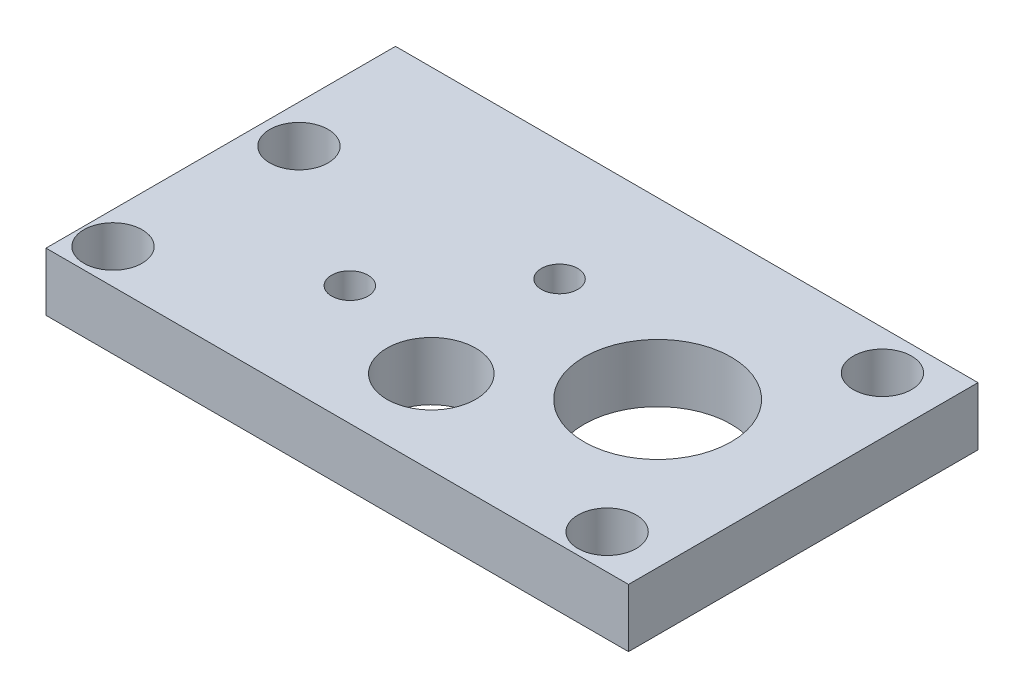
ISO-10303-21;
HEADER;
FILE_DESCRIPTION(('STEP AP214'),'2;1');
FILE_NAME('part.step','',(''),(''),'','','');
FILE_SCHEMA(('AUTOMOTIVE_DESIGN { 1 0 10303 214 1 1 1 1 }'));
ENDSEC;
DATA;
#1=APPLICATION_CONTEXT('core data for automotive mechanical design processes');
#2=APPLICATION_PROTOCOL_DEFINITION('international standard','automotive_design',2000,#1);
#3=PRODUCT_CONTEXT('',#1,'mechanical');
#4=PRODUCT('Part','Part','',(#3));
#5=PRODUCT_RELATED_PRODUCT_CATEGORY('part','',(#4));
#6=PRODUCT_DEFINITION_FORMATION('','',#4);
#7=PRODUCT_DEFINITION_CONTEXT('part definition',#1,'design');
#8=PRODUCT_DEFINITION('design','',#6,#7);
#9=PRODUCT_DEFINITION_SHAPE('','',#8);
#10=(LENGTH_UNIT() NAMED_UNIT(*) SI_UNIT(.MILLI.,.METRE.));
#11=(NAMED_UNIT(*) PLANE_ANGLE_UNIT() SI_UNIT($,.RADIAN.));
#12=(NAMED_UNIT(*) SI_UNIT($,.STERADIAN.) SOLID_ANGLE_UNIT());
#13=UNCERTAINTY_MEASURE_WITH_UNIT(LENGTH_MEASURE(1.E-05),#10,'distance_accuracy_value','');
#14=(GEOMETRIC_REPRESENTATION_CONTEXT(3) GLOBAL_UNCERTAINTY_ASSIGNED_CONTEXT((#13)) GLOBAL_UNIT_ASSIGNED_CONTEXT((#10,
#11,#12)) REPRESENTATION_CONTEXT('',''));
#15=CARTESIAN_POINT('',(0.,0.,0.));
#16=DIRECTION('',(0.,0.,1.));
#17=DIRECTION('',(1.,0.,0.));
#18=AXIS2_PLACEMENT_3D('',#15,#16,#17);
#19=CARTESIAN_POINT('',(1.31063028866199,0.,4.6262787538841));
#20=DIRECTION('',(0.,1.,0.));
#21=DIRECTION('',(0.,0.,1.));
#22=AXIS2_PLACEMENT_3D('',#19,#20,#21);
#23=CYLINDRICAL_SURFACE('',#22,0.7);
#24=CARTESIAN_POINT('',(1.31063028866199,0.,4.6262787538841));
#25=DIRECTION('',(0.,1.,0.));
#26=DIRECTION('',(0.,0.,1.));
#27=AXIS2_PLACEMENT_3D('',#24,#25,#26);
#28=CIRCLE('',#27,0.7);
#29=CARTESIAN_POINT('',(1.31063028866199,0.,5.3262787538841));
#30=VERTEX_POINT('',#29);
#31=EDGE_CURVE('E202',#30,#30,#28,.T.);
#32=ORIENTED_EDGE('',*,*,#31,.F.);
#33=EDGE_LOOP('',(#32));
#34=FACE_BOUND('',#33,.T.);
#35=CARTESIAN_POINT('',(1.31063028866199,0.5,4.6262787538841));
#36=DIRECTION('',(0.,1.,0.));
#37=DIRECTION('',(0.,0.,1.));
#38=AXIS2_PLACEMENT_3D('',#35,#36,#37);
#39=CIRCLE('',#38,0.7);
#40=CARTESIAN_POINT('',(1.31063028866199,0.5,5.3262787538841));
#41=VERTEX_POINT('',#40);
#42=EDGE_CURVE('E99',#41,#41,#39,.F.);
#43=ORIENTED_EDGE('',*,*,#42,.F.);
#44=EDGE_LOOP('',(#43));
#45=FACE_BOUND('',#44,.T.);
#46=ADVANCED_FACE('F95',(#34,#45),#23,.F.);
#47=CARTESIAN_POINT('',(18.0671599235635,0.,10.8014828316621));
#48=DIRECTION('',(0.,1.,0.));
#49=DIRECTION('',(0.,0.,1.));
#50=AXIS2_PLACEMENT_3D('',#47,#48,#49);
#51=CYLINDRICAL_SURFACE('',#50,0.699999999999998);
#52=CARTESIAN_POINT('',(18.0671599235635,0.,10.8014828316621));
#53=DIRECTION('',(0.,1.,0.));
#54=DIRECTION('',(0.,0.,1.));
#55=AXIS2_PLACEMENT_3D('',#52,#53,#54);
#56=CIRCLE('',#55,0.699999999999998);
#57=CARTESIAN_POINT('',(18.0671599235635,0.,11.5014828316621));
#58=VERTEX_POINT('',#57);
#59=EDGE_CURVE('E186',#58,#58,#56,.T.);
#60=ORIENTED_EDGE('',*,*,#59,.F.);
#61=EDGE_LOOP('',(#60));
#62=FACE_BOUND('',#61,.T.);
#63=CARTESIAN_POINT('',(18.0671599235635,0.5,10.8014828316621));
#64=DIRECTION('',(0.,1.,0.));
#65=DIRECTION('',(0.,0.,1.));
#66=AXIS2_PLACEMENT_3D('',#63,#64,#65);
#67=CIRCLE('',#66,0.699999999999998);
#68=CARTESIAN_POINT('',(18.0671599235635,0.5,11.5014828316621));
#69=VERTEX_POINT('',#68);
#70=EDGE_CURVE('E181',#69,#69,#67,.F.);
#71=ORIENTED_EDGE('',*,*,#70,.F.);
#72=EDGE_LOOP('',(#71));
#73=FACE_BOUND('',#72,.T.);
#74=ADVANCED_FACE('F246',(#62,#73),#51,.F.);
#75=CARTESIAN_POINT('',(18.0671599235635,0.,1.34892989004029));
#76=DIRECTION('',(0.,1.,0.));
#77=DIRECTION('',(0.,0.,1.));
#78=AXIS2_PLACEMENT_3D('',#75,#76,#77);
#79=CYLINDRICAL_SURFACE('',#78,0.699999999999998);
#80=CARTESIAN_POINT('',(18.0671599235635,0.,1.34892989004029));
#81=DIRECTION('',(0.,1.,0.));
#82=DIRECTION('',(0.,0.,1.));
#83=AXIS2_PLACEMENT_3D('',#80,#81,#82);
#84=CIRCLE('',#83,0.699999999999998);
#85=CARTESIAN_POINT('',(18.0671599235635,0.,2.04892989004029));
#86=VERTEX_POINT('',#85);
#87=EDGE_CURVE('E190',#86,#86,#84,.T.);
#88=ORIENTED_EDGE('',*,*,#87,.F.);
#89=EDGE_LOOP('',(#88));
#90=FACE_BOUND('',#89,.T.);
#91=CARTESIAN_POINT('',(18.0671599235635,0.5,1.34892989004029));
#92=DIRECTION('',(0.,1.,0.));
#93=DIRECTION('',(0.,0.,1.));
#94=AXIS2_PLACEMENT_3D('',#91,#92,#93);
#95=CIRCLE('',#94,0.699999999999998);
#96=CARTESIAN_POINT('',(18.0671599235635,0.5,2.04892989004029));
#97=VERTEX_POINT('',#96);
#98=EDGE_CURVE('E178',#97,#97,#95,.F.);
#99=ORIENTED_EDGE('',*,*,#98,.F.);
#100=EDGE_LOOP('',(#99));
#101=FACE_BOUND('',#100,.T.);
#102=ADVANCED_FACE('F252',(#90,#101),#79,.F.);
#103=CARTESIAN_POINT('',(1.1013013368729,0.,10.8014828316621));
#104=DIRECTION('',(0.,1.,0.));
#105=DIRECTION('',(0.,0.,1.));
#106=AXIS2_PLACEMENT_3D('',#103,#104,#105);
#107=CYLINDRICAL_SURFACE('',#106,0.700000000000001);
#108=CARTESIAN_POINT('',(1.1013013368729,0.,10.8014828316621));
#109=DIRECTION('',(0.,1.,0.));
#110=DIRECTION('',(0.,0.,1.));
#111=AXIS2_PLACEMENT_3D('',#108,#109,#110);
#112=CIRCLE('',#111,0.700000000000001);
#113=CARTESIAN_POINT('',(1.1013013368729,0.,11.5014828316621));
#114=VERTEX_POINT('',#113);
#115=EDGE_CURVE('E195',#114,#114,#112,.T.);
#116=ORIENTED_EDGE('',*,*,#115,.F.);
#117=EDGE_LOOP('',(#116));
#118=FACE_BOUND('',#117,.T.);
#119=CARTESIAN_POINT('',(1.1013013368729,0.5,10.8014828316621));
#120=DIRECTION('',(0.,1.,0.));
#121=DIRECTION('',(0.,0.,1.));
#122=AXIS2_PLACEMENT_3D('',#119,#120,#121);
#123=CIRCLE('',#122,0.700000000000001);
#124=CARTESIAN_POINT('',(1.1013013368729,0.5,11.5014828316621));
#125=VERTEX_POINT('',#124);
#126=EDGE_CURVE('E175',#125,#125,#123,.F.);
#127=ORIENTED_EDGE('',*,*,#126,.F.);
#128=EDGE_LOOP('',(#127));
#129=FACE_BOUND('',#128,.T.);
#130=ADVANCED_FACE('F281',(#118,#129),#107,.F.);
#131=CARTESIAN_POINT('',(0.,2.,0.));
#132=DIRECTION('',(0.,-1.,0.));
#133=DIRECTION('',(0.,0.,-1.));
#134=AXIS2_PLACEMENT_3D('',#131,#132,#133);
#135=PLANE('',#134);
#136=CARTESIAN_POINT('',(18.0671599235635,2.,1.34892989004029));
#137=DIRECTION('',(0.,1.,0.));
#138=DIRECTION('',(0.,0.,1.));
#139=AXIS2_PLACEMENT_3D('',#136,#137,#138);
#140=CIRCLE('',#139,1.);
#141=CARTESIAN_POINT('',(18.0671599235635,2.,2.34892989004029));
#142=VERTEX_POINT('',#141);
#143=EDGE_CURVE('E457',#142,#142,#140,.T.);
#144=ORIENTED_EDGE('',*,*,#143,.F.);
#145=EDGE_LOOP('',(#144));
#146=FACE_BOUND('',#145,.T.);
#147=CARTESIAN_POINT('',(18.0671599235635,2.,10.8014828316621));
#148=DIRECTION('',(0.,1.,0.));
#149=DIRECTION('',(0.,0.,1.));
#150=AXIS2_PLACEMENT_3D('',#147,#148,#149);
#151=CIRCLE('',#150,1.);
#152=CARTESIAN_POINT('',(18.0671599235635,2.,11.8014828316621));
#153=VERTEX_POINT('',#152);
#154=EDGE_CURVE('E449',#153,#153,#151,.T.);
#155=ORIENTED_EDGE('',*,*,#154,.F.);
#156=EDGE_LOOP('',(#155));
#157=FACE_BOUND('',#156,.T.);
#158=CARTESIAN_POINT('',(1.1013013368729,2.,10.8014828316621));
#159=DIRECTION('',(0.,1.,0.));
#160=DIRECTION('',(0.,0.,1.));
#161=AXIS2_PLACEMENT_3D('',#158,#159,#160);
#162=CIRCLE('',#161,1.);
#163=CARTESIAN_POINT('',(1.1013013368729,2.,11.8014828316621));
#164=VERTEX_POINT('',#163);
#165=EDGE_CURVE('E442',#164,#164,#162,.T.);
#166=ORIENTED_EDGE('',*,*,#165,.F.);
#167=EDGE_LOOP('',(#166));
#168=FACE_BOUND('',#167,.T.);
#169=CARTESIAN_POINT('',(1.31063028866199,2.,4.6262787538841));
#170=DIRECTION('',(0.,1.,0.));
#171=DIRECTION('',(0.,0.,1.));
#172=AXIS2_PLACEMENT_3D('',#169,#170,#171);
#173=CIRCLE('',#172,1.);
#174=CARTESIAN_POINT('',(1.31063028866199,2.,5.6262787538841));
#175=VERTEX_POINT('',#174);
#176=EDGE_CURVE('E199',#175,#175,#173,.T.);
#177=ORIENTED_EDGE('',*,*,#176,.F.);
#178=EDGE_LOOP('',(#177));
#179=FACE_BOUND('',#178,.T.);
#180=DIRECTION('',(1.,0.,0.));
#181=VECTOR('',#180,1.);
#182=CARTESIAN_POINT('',(0.,2.,0.));
#183=LINE('',#182,#181);
#184=CARTESIAN_POINT('',(0.,2.,0.));
#185=VERTEX_POINT('',#184);
#186=CARTESIAN_POINT('',(20.,2.,0.));
#187=VERTEX_POINT('',#186);
#188=EDGE_CURVE('E159',#185,#187,#183,.T.);
#189=ORIENTED_EDGE('',*,*,#188,.F.);
#190=DIRECTION('',(0.,0.,1.));
#191=VECTOR('',#190,1.);
#192=CARTESIAN_POINT('',(0.,2.,0.));
#193=LINE('',#192,#191);
#194=CARTESIAN_POINT('',(0.,2.,12.));
#195=VERTEX_POINT('',#194);
#196=EDGE_CURVE('E148',#185,#195,#193,.T.);
#197=ORIENTED_EDGE('',*,*,#196,.T.);
#198=DIRECTION('',(1.,0.,0.));
#199=VECTOR('',#198,1.);
#200=CARTESIAN_POINT('',(0.,2.,12.));
#201=LINE('',#200,#199);
#202=CARTESIAN_POINT('',(20.,2.,12.));
#203=VERTEX_POINT('',#202);
#204=EDGE_CURVE('E142',#195,#203,#201,.T.);
#205=ORIENTED_EDGE('',*,*,#204,.T.);
#206=DIRECTION('',(0.,0.,1.));
#207=VECTOR('',#206,1.);
#208=CARTESIAN_POINT('',(20.,2.,0.));
#209=LINE('',#208,#207);
#210=EDGE_CURVE('E147',#187,#203,#209,.T.);
#211=ORIENTED_EDGE('',*,*,#210,.F.);
#212=EDGE_LOOP('',(#189,#197,#205,#211));
#213=FACE_BOUND('',#212,.T.);
#214=CARTESIAN_POINT('',(9.73286382647969,2.,4.1));
#215=DIRECTION('',(0.,1.,0.));
#216=DIRECTION('',(0.,0.,1.));
#217=AXIS2_PLACEMENT_3D('',#214,#215,#216);
#218=CIRCLE('',#217,0.625000000000001);
#219=CARTESIAN_POINT('',(9.73286382647969,2.,4.725));
#220=VERTEX_POINT('',#219);
#221=EDGE_CURVE('E169',#220,#220,#218,.T.);
#222=ORIENTED_EDGE('',*,*,#221,.F.);
#223=EDGE_LOOP('',(#222));
#224=FACE_BOUND('',#223,.T.);
#225=CARTESIAN_POINT('',(10.3501019215946,2.,9.12064862816079));
#226=DIRECTION('',(0.,1.,0.));
#227=DIRECTION('',(0.,0.,1.));
#228=AXIS2_PLACEMENT_3D('',#225,#226,#227);
#229=CIRCLE('',#228,1.525);
#230=CARTESIAN_POINT('',(10.3501019215946,2.,10.6456486281608));
#231=VERTEX_POINT('',#230);
#232=EDGE_CURVE('E219',#231,#231,#229,.T.);
#233=ORIENTED_EDGE('',*,*,#232,.F.);
#234=EDGE_LOOP('',(#233));
#235=FACE_BOUND('',#234,.T.);
#236=CARTESIAN_POINT('',(6.33139355614071,2.,7.9));
#237=DIRECTION('',(0.,1.,0.));
#238=DIRECTION('',(0.,0.,1.));
#239=AXIS2_PLACEMENT_3D('',#236,#237,#238);
#240=CIRCLE('',#239,0.625);
#241=CARTESIAN_POINT('',(6.33139355614071,2.,8.525));
#242=VERTEX_POINT('',#241);
#243=EDGE_CURVE('E213',#242,#242,#240,.T.);
#244=ORIENTED_EDGE('',*,*,#243,.F.);
#245=EDGE_LOOP('',(#244));
#246=FACE_BOUND('',#245,.T.);
#247=CARTESIAN_POINT('',(15.,2.,6.));
#248=DIRECTION('',(0.,1.,0.));
#249=DIRECTION('',(0.,0.,1.));
#250=AXIS2_PLACEMENT_3D('',#247,#248,#249);
#251=CIRCLE('',#250,2.525);
#252=CARTESIAN_POINT('',(15.,2.,8.525));
#253=VERTEX_POINT('',#252);
#254=EDGE_CURVE('E207',#253,#253,#251,.T.);
#255=ORIENTED_EDGE('',*,*,#254,.F.);
#256=EDGE_LOOP('',(#255));
#257=FACE_BOUND('',#256,.T.);
#258=ADVANCED_FACE('F145',(#146,#157,#168,#179,#213,#224,#235,#246,#257),#135,.F.);
#259=CARTESIAN_POINT('',(0.,0.,0.));
#260=DIRECTION('',(0.,-1.,0.));
#261=DIRECTION('',(0.,0.,-1.));
#262=AXIS2_PLACEMENT_3D('',#259,#260,#261);
#263=PLANE('',#262);
#264=ORIENTED_EDGE('',*,*,#115,.T.);
#265=EDGE_LOOP('',(#264));
#266=FACE_BOUND('',#265,.T.);
#267=ORIENTED_EDGE('',*,*,#87,.T.);
#268=EDGE_LOOP('',(#267));
#269=FACE_BOUND('',#268,.T.);
#270=ORIENTED_EDGE('',*,*,#59,.T.);
#271=EDGE_LOOP('',(#270));
#272=FACE_BOUND('',#271,.T.);
#273=ORIENTED_EDGE('',*,*,#31,.T.);
#274=EDGE_LOOP('',(#273));
#275=FACE_BOUND('',#274,.T.);
#276=CARTESIAN_POINT('',(6.33139355614071,0.,7.9));
#277=DIRECTION('',(0.,1.,0.));
#278=DIRECTION('',(0.,0.,1.));
#279=AXIS2_PLACEMENT_3D('',#276,#277,#278);
#280=CIRCLE('',#279,0.625);
#281=CARTESIAN_POINT('',(6.33139355614071,0.,8.525));
#282=VERTEX_POINT('',#281);
#283=EDGE_CURVE('E210',#282,#282,#280,.T.);
#284=ORIENTED_EDGE('',*,*,#283,.T.);
#285=EDGE_LOOP('',(#284));
#286=FACE_BOUND('',#285,.T.);
#287=CARTESIAN_POINT('',(9.73286382647969,0.,4.1));
#288=DIRECTION('',(0.,1.,0.));
#289=DIRECTION('',(0.,0.,1.));
#290=AXIS2_PLACEMENT_3D('',#287,#288,#289);
#291=CIRCLE('',#290,0.625000000000001);
#292=CARTESIAN_POINT('',(9.73286382647969,0.,4.725));
#293=VERTEX_POINT('',#292);
#294=EDGE_CURVE('E222',#293,#293,#291,.T.);
#295=ORIENTED_EDGE('',*,*,#294,.T.);
#296=EDGE_LOOP('',(#295));
#297=FACE_BOUND('',#296,.T.);
#298=DIRECTION('',(1.,0.,0.));
#299=VECTOR('',#298,1.);
#300=CARTESIAN_POINT('',(0.,0.,0.));
#301=LINE('',#300,#299);
#302=CARTESIAN_POINT('',(0.,0.,0.));
#303=VERTEX_POINT('',#302);
#304=CARTESIAN_POINT('',(20.,0.,0.));
#305=VERTEX_POINT('',#304);
#306=EDGE_CURVE('E165',#303,#305,#301,.T.);
#307=ORIENTED_EDGE('',*,*,#306,.T.);
#308=DIRECTION('',(0.,0.,1.));
#309=VECTOR('',#308,1.);
#310=CARTESIAN_POINT('',(20.,0.,0.));
#311=LINE('',#310,#309);
#312=CARTESIAN_POINT('',(20.,0.,12.));
#313=VERTEX_POINT('',#312);
#314=EDGE_CURVE('E168',#305,#313,#311,.T.);
#315=ORIENTED_EDGE('',*,*,#314,.T.);
#316=DIRECTION('',(1.,0.,0.));
#317=VECTOR('',#316,1.);
#318=CARTESIAN_POINT('',(0.,0.,12.));
#319=LINE('',#318,#317);
#320=CARTESIAN_POINT('',(0.,0.,12.));
#321=VERTEX_POINT('',#320);
#322=EDGE_CURVE('E155',#321,#313,#319,.T.);
#323=ORIENTED_EDGE('',*,*,#322,.F.);
#324=DIRECTION('',(0.,0.,1.));
#325=VECTOR('',#324,1.);
#326=CARTESIAN_POINT('',(0.,0.,0.));
#327=LINE('',#326,#325);
#328=EDGE_CURVE('E129',#303,#321,#327,.T.);
#329=ORIENTED_EDGE('',*,*,#328,.F.);
#330=EDGE_LOOP('',(#307,#315,#323,#329));
#331=FACE_BOUND('',#330,.T.);
#332=CARTESIAN_POINT('',(10.3501019215946,0.,9.12064862816079));
#333=DIRECTION('',(0.,1.,0.));
#334=DIRECTION('',(0.,0.,1.));
#335=AXIS2_PLACEMENT_3D('',#332,#333,#334);
#336=CIRCLE('',#335,1.525);
#337=CARTESIAN_POINT('',(10.3501019215946,0.,10.6456486281608));
#338=VERTEX_POINT('',#337);
#339=EDGE_CURVE('E216',#338,#338,#336,.T.);
#340=ORIENTED_EDGE('',*,*,#339,.T.);
#341=EDGE_LOOP('',(#340));
#342=FACE_BOUND('',#341,.T.);
#343=CARTESIAN_POINT('',(15.,0.,6.));
#344=DIRECTION('',(0.,1.,0.));
#345=DIRECTION('',(0.,0.,1.));
#346=AXIS2_PLACEMENT_3D('',#343,#344,#345);
#347=CIRCLE('',#346,2.525);
#348=CARTESIAN_POINT('',(15.,0.,8.525));
#349=VERTEX_POINT('',#348);
#350=EDGE_CURVE('E206',#349,#349,#347,.T.);
#351=ORIENTED_EDGE('',*,*,#350,.T.);
#352=EDGE_LOOP('',(#351));
#353=FACE_BOUND('',#352,.T.);
#354=ADVANCED_FACE('F229',(#266,#269,#272,#275,#286,#297,#331,#342,#353),#263,.T.);
#355=CARTESIAN_POINT('',(0.,2.,0.));
#356=DIRECTION('',(0.,0.,-1.));
#357=DIRECTION('',(-1.,0.,0.));
#358=AXIS2_PLACEMENT_3D('',#355,#356,#357);
#359=PLANE('',#358);
#360=ORIENTED_EDGE('',*,*,#306,.F.);
#361=DIRECTION('',(0.,-1.,0.));
#362=VECTOR('',#361,1.);
#363=CARTESIAN_POINT('',(0.,2.,0.));
#364=LINE('',#363,#362);
#365=EDGE_CURVE('E12',#185,#303,#364,.T.);
#366=ORIENTED_EDGE('',*,*,#365,.F.);
#367=ORIENTED_EDGE('',*,*,#188,.T.);
#368=DIRECTION('',(0.,-1.,0.));
#369=VECTOR('',#368,1.);
#370=CARTESIAN_POINT('',(20.,2.,0.));
#371=LINE('',#370,#369);
#372=EDGE_CURVE('E137',#187,#305,#371,.T.);
#373=ORIENTED_EDGE('',*,*,#372,.T.);
#374=EDGE_LOOP('',(#360,#366,#367,#373));
#375=FACE_BOUND('',#374,.T.);
#376=ADVANCED_FACE('F97',(#375),#359,.T.);
#377=CARTESIAN_POINT('',(0.,2.,0.));
#378=DIRECTION('',(1.,0.,0.));
#379=DIRECTION('',(0.,0.,-1.));
#380=AXIS2_PLACEMENT_3D('',#377,#378,#379);
#381=PLANE('',#380);
#382=ORIENTED_EDGE('',*,*,#328,.T.);
#383=DIRECTION('',(0.,-1.,0.));
#384=VECTOR('',#383,1.);
#385=CARTESIAN_POINT('',(0.,2.,12.));
#386=LINE('',#385,#384);
#387=EDGE_CURVE('E105',#195,#321,#386,.T.);
#388=ORIENTED_EDGE('',*,*,#387,.F.);
#389=ORIENTED_EDGE('',*,*,#196,.F.);
#390=ORIENTED_EDGE('',*,*,#365,.T.);
#391=EDGE_LOOP('',(#382,#388,#389,#390));
#392=FACE_BOUND('',#391,.T.);
#393=ADVANCED_FACE('F280',(#392),#381,.F.);
#394=CARTESIAN_POINT('',(0.,2.,12.));
#395=DIRECTION('',(0.,0.,-1.));
#396=DIRECTION('',(-1.,0.,0.));
#397=AXIS2_PLACEMENT_3D('',#394,#395,#396);
#398=PLANE('',#397);
#399=ORIENTED_EDGE('',*,*,#322,.T.);
#400=DIRECTION('',(0.,-1.,0.));
#401=VECTOR('',#400,1.);
#402=CARTESIAN_POINT('',(20.,2.,12.));
#403=LINE('',#402,#401);
#404=EDGE_CURVE('E152',#203,#313,#403,.T.);
#405=ORIENTED_EDGE('',*,*,#404,.F.);
#406=ORIENTED_EDGE('',*,*,#204,.F.);
#407=ORIENTED_EDGE('',*,*,#387,.T.);
#408=EDGE_LOOP('',(#399,#405,#406,#407));
#409=FACE_BOUND('',#408,.T.);
#410=ADVANCED_FACE('F153',(#409),#398,.F.);
#411=CARTESIAN_POINT('',(20.,2.,0.));
#412=DIRECTION('',(1.,0.,0.));
#413=DIRECTION('',(0.,0.,-1.));
#414=AXIS2_PLACEMENT_3D('',#411,#412,#413);
#415=PLANE('',#414);
#416=ORIENTED_EDGE('',*,*,#314,.F.);
#417=ORIENTED_EDGE('',*,*,#372,.F.);
#418=ORIENTED_EDGE('',*,*,#210,.T.);
#419=ORIENTED_EDGE('',*,*,#404,.T.);
#420=EDGE_LOOP('',(#416,#417,#418,#419));
#421=FACE_BOUND('',#420,.T.);
#422=ADVANCED_FACE('F158',(#421),#415,.T.);
#423=CARTESIAN_POINT('',(9.73286382647969,2.,4.1));
#424=DIRECTION('',(0.,-1.,0.));
#425=DIRECTION('',(0.,0.,-1.));
#426=AXIS2_PLACEMENT_3D('',#423,#424,#425);
#427=CYLINDRICAL_SURFACE('',#426,0.625000000000001);
#428=ORIENTED_EDGE('',*,*,#221,.T.);
#429=EDGE_LOOP('',(#428));
#430=FACE_BOUND('',#429,.T.);
#431=ORIENTED_EDGE('',*,*,#294,.F.);
#432=EDGE_LOOP('',(#431));
#433=FACE_BOUND('',#432,.T.);
#434=ADVANCED_FACE('F232',(#430,#433),#427,.F.);
#435=CARTESIAN_POINT('',(10.3501019215946,2.,9.12064862816079));
#436=DIRECTION('',(0.,-1.,0.));
#437=DIRECTION('',(0.,0.,-1.));
#438=AXIS2_PLACEMENT_3D('',#435,#436,#437);
#439=CYLINDRICAL_SURFACE('',#438,1.525);
#440=ORIENTED_EDGE('',*,*,#232,.T.);
#441=EDGE_LOOP('',(#440));
#442=FACE_BOUND('',#441,.T.);
#443=ORIENTED_EDGE('',*,*,#339,.F.);
#444=EDGE_LOOP('',(#443));
#445=FACE_BOUND('',#444,.T.);
#446=ADVANCED_FACE('F234',(#442,#445),#439,.F.);
#447=CARTESIAN_POINT('',(6.33139355614071,2.,7.9));
#448=DIRECTION('',(0.,-1.,0.));
#449=DIRECTION('',(0.,0.,-1.));
#450=AXIS2_PLACEMENT_3D('',#447,#448,#449);
#451=CYLINDRICAL_SURFACE('',#450,0.625);
#452=ORIENTED_EDGE('',*,*,#243,.T.);
#453=EDGE_LOOP('',(#452));
#454=FACE_BOUND('',#453,.T.);
#455=ORIENTED_EDGE('',*,*,#283,.F.);
#456=EDGE_LOOP('',(#455));
#457=FACE_BOUND('',#456,.T.);
#458=ADVANCED_FACE('F241',(#454,#457),#451,.F.);
#459=CARTESIAN_POINT('',(15.,2.,6.));
#460=DIRECTION('',(0.,-1.,0.));
#461=DIRECTION('',(0.,0.,-1.));
#462=AXIS2_PLACEMENT_3D('',#459,#460,#461);
#463=CYLINDRICAL_SURFACE('',#462,2.525);
#464=ORIENTED_EDGE('',*,*,#254,.T.);
#465=EDGE_LOOP('',(#464));
#466=FACE_BOUND('',#465,.T.);
#467=ORIENTED_EDGE('',*,*,#350,.F.);
#468=EDGE_LOOP('',(#467));
#469=FACE_BOUND('',#468,.T.);
#470=ADVANCED_FACE('F260',(#466,#469),#463,.F.);
#471=CARTESIAN_POINT('',(1.1013013368729,0.5,10.8014828316621));
#472=DIRECTION('',(0.,1.,0.));
#473=DIRECTION('',(0.,0.,1.));
#474=AXIS2_PLACEMENT_3D('',#471,#472,#473);
#475=PLANE('',#474);
#476=CARTESIAN_POINT('',(1.1013013368729,0.5,10.8014828316621));
#477=DIRECTION('',(0.,1.,0.));
#478=DIRECTION('',(0.,0.,1.));
#479=AXIS2_PLACEMENT_3D('',#476,#477,#478);
#480=CIRCLE('',#479,1.);
#481=CARTESIAN_POINT('',(1.1013013368729,0.5,11.8014828316621));
#482=VERTEX_POINT('',#481);
#483=EDGE_CURVE('E444',#482,#482,#480,.T.);
#484=ORIENTED_EDGE('',*,*,#483,.T.);
#485=EDGE_LOOP('',(#484));
#486=FACE_BOUND('',#485,.T.);
#487=ORIENTED_EDGE('',*,*,#126,.T.);
#488=EDGE_LOOP('',(#487));
#489=FACE_BOUND('',#488,.T.);
#490=ADVANCED_FACE('F263',(#486,#489),#475,.T.);
#491=CARTESIAN_POINT('',(1.1013013368729,0.5,10.8014828316621));
#492=DIRECTION('',(0.,1.,0.));
#493=DIRECTION('',(0.,0.,1.));
#494=AXIS2_PLACEMENT_3D('',#491,#492,#493);
#495=CYLINDRICAL_SURFACE('',#494,1.);
#496=ORIENTED_EDGE('',*,*,#483,.F.);
#497=EDGE_LOOP('',(#496));
#498=FACE_BOUND('',#497,.T.);
#499=ORIENTED_EDGE('',*,*,#165,.T.);
#500=EDGE_LOOP('',(#499));
#501=FACE_BOUND('',#500,.T.);
#502=ADVANCED_FACE('F362',(#498,#501),#495,.F.);
#503=CARTESIAN_POINT('',(18.0671599235635,0.5,1.34892989004029));
#504=DIRECTION('',(0.,1.,0.));
#505=DIRECTION('',(0.,0.,1.));
#506=AXIS2_PLACEMENT_3D('',#503,#504,#505);
#507=PLANE('',#506);
#508=CARTESIAN_POINT('',(18.0671599235635,0.5,1.34892989004029));
#509=DIRECTION('',(0.,1.,0.));
#510=DIRECTION('',(0.,0.,1.));
#511=AXIS2_PLACEMENT_3D('',#508,#509,#510);
#512=CIRCLE('',#511,1.);
#513=CARTESIAN_POINT('',(18.0671599235635,0.5,2.34892989004029));
#514=VERTEX_POINT('',#513);
#515=EDGE_CURVE('E460',#514,#514,#512,.T.);
#516=ORIENTED_EDGE('',*,*,#515,.T.);
#517=EDGE_LOOP('',(#516));
#518=FACE_BOUND('',#517,.T.);
#519=ORIENTED_EDGE('',*,*,#98,.T.);
#520=EDGE_LOOP('',(#519));
#521=FACE_BOUND('',#520,.T.);
#522=ADVANCED_FACE('F372',(#518,#521),#507,.T.);
#523=CARTESIAN_POINT('',(18.0671599235635,0.5,1.34892989004029));
#524=DIRECTION('',(0.,1.,0.));
#525=DIRECTION('',(0.,0.,1.));
#526=AXIS2_PLACEMENT_3D('',#523,#524,#525);
#527=CYLINDRICAL_SURFACE('',#526,1.);
#528=ORIENTED_EDGE('',*,*,#515,.F.);
#529=EDGE_LOOP('',(#528));
#530=FACE_BOUND('',#529,.T.);
#531=ORIENTED_EDGE('',*,*,#143,.T.);
#532=EDGE_LOOP('',(#531));
#533=FACE_BOUND('',#532,.T.);
#534=ADVANCED_FACE('F382',(#530,#533),#527,.F.);
#535=CARTESIAN_POINT('',(18.0671599235635,0.5,10.8014828316621));
#536=DIRECTION('',(0.,1.,0.));
#537=DIRECTION('',(0.,0.,1.));
#538=AXIS2_PLACEMENT_3D('',#535,#536,#537);
#539=PLANE('',#538);
#540=CARTESIAN_POINT('',(18.0671599235635,0.5,10.8014828316621));
#541=DIRECTION('',(0.,1.,0.));
#542=DIRECTION('',(0.,0.,1.));
#543=AXIS2_PLACEMENT_3D('',#540,#541,#542);
#544=CIRCLE('',#543,1.);
#545=CARTESIAN_POINT('',(18.0671599235635,0.5,11.8014828316621));
#546=VERTEX_POINT('',#545);
#547=EDGE_CURVE('E454',#546,#546,#544,.T.);
#548=ORIENTED_EDGE('',*,*,#547,.T.);
#549=EDGE_LOOP('',(#548));
#550=FACE_BOUND('',#549,.T.);
#551=ORIENTED_EDGE('',*,*,#70,.T.);
#552=EDGE_LOOP('',(#551));
#553=FACE_BOUND('',#552,.T.);
#554=ADVANCED_FACE('F392',(#550,#553),#539,.T.);
#555=CARTESIAN_POINT('',(18.0671599235635,0.5,10.8014828316621));
#556=DIRECTION('',(0.,1.,0.));
#557=DIRECTION('',(0.,0.,1.));
#558=AXIS2_PLACEMENT_3D('',#555,#556,#557);
#559=CYLINDRICAL_SURFACE('',#558,1.);
#560=ORIENTED_EDGE('',*,*,#547,.F.);
#561=EDGE_LOOP('',(#560));
#562=FACE_BOUND('',#561,.T.);
#563=ORIENTED_EDGE('',*,*,#154,.T.);
#564=EDGE_LOOP('',(#563));
#565=FACE_BOUND('',#564,.T.);
#566=ADVANCED_FACE('F402',(#562,#565),#559,.F.);
#567=CARTESIAN_POINT('',(1.31063028866199,0.5,4.6262787538841));
#568=DIRECTION('',(0.,1.,0.));
#569=DIRECTION('',(0.,0.,1.));
#570=AXIS2_PLACEMENT_3D('',#567,#568,#569);
#571=PLANE('',#570);
#572=CARTESIAN_POINT('',(1.31063028866199,0.5,4.6262787538841));
#573=DIRECTION('',(0.,1.,0.));
#574=DIRECTION('',(0.,0.,1.));
#575=AXIS2_PLACEMENT_3D('',#572,#573,#574);
#576=CIRCLE('',#575,1.);
#577=CARTESIAN_POINT('',(1.31063028866199,0.5,5.6262787538841));
#578=VERTEX_POINT('',#577);
#579=EDGE_CURVE('E179',#578,#578,#576,.T.);
#580=ORIENTED_EDGE('',*,*,#579,.T.);
#581=EDGE_LOOP('',(#580));
#582=FACE_BOUND('',#581,.T.);
#583=ORIENTED_EDGE('',*,*,#42,.T.);
#584=EDGE_LOOP('',(#583));
#585=FACE_BOUND('',#584,.T.);
#586=ADVANCED_FACE('F412',(#582,#585),#571,.T.);
#587=CARTESIAN_POINT('',(1.31063028866199,0.5,4.6262787538841));
#588=DIRECTION('',(0.,1.,0.));
#589=DIRECTION('',(0.,0.,1.));
#590=AXIS2_PLACEMENT_3D('',#587,#588,#589);
#591=CYLINDRICAL_SURFACE('',#590,1.);
#592=ORIENTED_EDGE('',*,*,#579,.F.);
#593=EDGE_LOOP('',(#592));
#594=FACE_BOUND('',#593,.T.);
#595=ORIENTED_EDGE('',*,*,#176,.T.);
#596=EDGE_LOOP('',(#595));
#597=FACE_BOUND('',#596,.T.);
#598=ADVANCED_FACE('F422',(#594,#597),#591,.F.);
#599=CLOSED_SHELL('',(#46,#74,#102,#130,#258,#354,#376,#393,#410,#422,#434,#446,#458,#470,#490,
#502,#522,#534,#554,#566,#586,#598));
#600=MANIFOLD_SOLID_BREP('B2',#599);
#601=ADVANCED_BREP_SHAPE_REPRESENTATION('',(#18,#600),#14);
#602=SHAPE_DEFINITION_REPRESENTATION(#9,#601);
ENDSEC;
END-ISO-10303-21;
